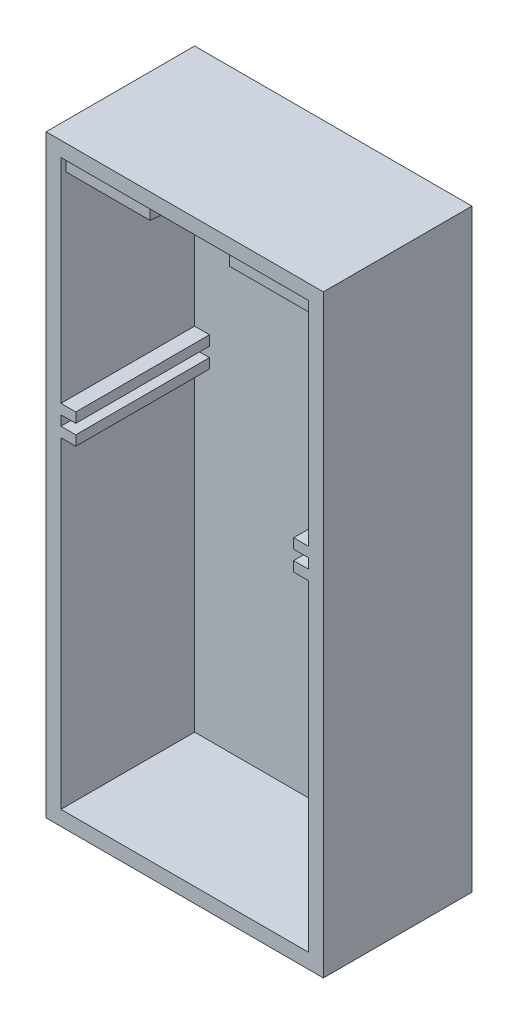
ISO-10303-21;
HEADER;
FILE_DESCRIPTION(('STEP AP214'),'2;1');
FILE_NAME('part.step','',(''),(''),'','','');
FILE_SCHEMA(('AUTOMOTIVE_DESIGN { 1 0 10303 214 1 1 1 1 }'));
ENDSEC;
DATA;
#1=APPLICATION_CONTEXT('core data for automotive mechanical design processes');
#2=APPLICATION_PROTOCOL_DEFINITION('international standard','automotive_design',2000,#1);
#3=PRODUCT_CONTEXT('',#1,'mechanical');
#4=PRODUCT('Part','Part','',(#3));
#5=PRODUCT_RELATED_PRODUCT_CATEGORY('part','',(#4));
#6=PRODUCT_DEFINITION_FORMATION('','',#4);
#7=PRODUCT_DEFINITION_CONTEXT('part definition',#1,'design');
#8=PRODUCT_DEFINITION('design','',#6,#7);
#9=PRODUCT_DEFINITION_SHAPE('','',#8);
#10=(LENGTH_UNIT() NAMED_UNIT(*) SI_UNIT(.MILLI.,.METRE.));
#11=(NAMED_UNIT(*) PLANE_ANGLE_UNIT() SI_UNIT($,.RADIAN.));
#12=(NAMED_UNIT(*) SI_UNIT($,.STERADIAN.) SOLID_ANGLE_UNIT());
#13=UNCERTAINTY_MEASURE_WITH_UNIT(LENGTH_MEASURE(1.E-05),#10,'distance_accuracy_value','');
#14=(GEOMETRIC_REPRESENTATION_CONTEXT(3) GLOBAL_UNCERTAINTY_ASSIGNED_CONTEXT((#13)) GLOBAL_UNIT_ASSIGNED_CONTEXT((#10,
#11,#12)) REPRESENTATION_CONTEXT('',''));
#15=CARTESIAN_POINT('',(0.,0.,0.));
#16=DIRECTION('',(0.,0.,1.));
#17=DIRECTION('',(1.,0.,0.));
#18=AXIS2_PLACEMENT_3D('',#15,#16,#17);
#19=CARTESIAN_POINT('',(-3.,0.,30.));
#20=DIRECTION('',(-1.,0.,0.));
#21=DIRECTION('',(0.,0.,1.));
#22=AXIS2_PLACEMENT_3D('',#19,#20,#21);
#23=PLANE('',#22);
#24=DIRECTION('',(0.,0.,1.));
#25=VECTOR('',#24,1.);
#26=CARTESIAN_POINT('',(-3.,70.,30.));
#27=LINE('',#26,#25);
#28=CARTESIAN_POINT('',(-3.,70.,3.));
#29=VERTEX_POINT('',#28);
#30=CARTESIAN_POINT('',(-3.,70.,30.));
#31=VERTEX_POINT('',#30);
#32=EDGE_CURVE('E244',#29,#31,#27,.T.);
#33=ORIENTED_EDGE('',*,*,#32,.T.);
#34=DIRECTION('',(0.,1.,0.));
#35=VECTOR('',#34,1.);
#36=CARTESIAN_POINT('',(-3.,0.,30.));
#37=LINE('',#36,#35);
#38=CARTESIAN_POINT('',(-3.,72.,30.));
#39=VERTEX_POINT('',#38);
#40=EDGE_CURVE('E236',#31,#39,#37,.T.);
#41=ORIENTED_EDGE('',*,*,#40,.T.);
#42=DIRECTION('',(0.,0.,-1.));
#43=VECTOR('',#42,1.);
#44=CARTESIAN_POINT('',(-3.,72.,30.));
#45=LINE('',#44,#43);
#46=CARTESIAN_POINT('',(-3.,72.,3.));
#47=VERTEX_POINT('',#46);
#48=EDGE_CURVE('E258',#39,#47,#45,.T.);
#49=ORIENTED_EDGE('',*,*,#48,.T.);
#50=DIRECTION('',(0.,1.,0.));
#51=VECTOR('',#50,1.);
#52=CARTESIAN_POINT('',(-3.,0.,3.));
#53=LINE('',#52,#51);
#54=EDGE_CURVE('E369',#29,#47,#53,.T.);
#55=ORIENTED_EDGE('',*,*,#54,.F.);
#56=EDGE_LOOP('',(#33,#41,#49,#55));
#57=FACE_BOUND('',#56,.T.);
#58=ADVANCED_FACE('F33',(#57),#23,.T.);
#59=DIRECTION('',(0.,0.,1.));
#60=VECTOR('',#59,1.);
#61=CARTESIAN_POINT('',(-3.,74.,30.));
#62=LINE('',#61,#60);
#63=CARTESIAN_POINT('',(-3.,74.,3.));
#64=VERTEX_POINT('',#63);
#65=CARTESIAN_POINT('',(-3.,74.,30.));
#66=VERTEX_POINT('',#65);
#67=EDGE_CURVE('E253',#64,#66,#62,.T.);
#68=ORIENTED_EDGE('',*,*,#67,.T.);
#69=CARTESIAN_POINT('',(-3.,117.,30.));
#70=VERTEX_POINT('',#69);
#71=EDGE_CURVE('E390',#66,#70,#37,.T.);
#72=ORIENTED_EDGE('',*,*,#71,.T.);
#73=DIRECTION('',(0.,0.,-1.));
#74=VECTOR('',#73,1.);
#75=CARTESIAN_POINT('',(-3.,117.,30.));
#76=LINE('',#75,#74);
#77=CARTESIAN_POINT('',(-3.,117.,29.));
#78=VERTEX_POINT('',#77);
#79=EDGE_CURVE('E370',#70,#78,#76,.T.);
#80=ORIENTED_EDGE('',*,*,#79,.T.);
#81=DIRECTION('',(0.,1.,0.));
#82=VECTOR('',#81,1.);
#83=CARTESIAN_POINT('',(-3.,117.,29.));
#84=LINE('',#83,#82);
#85=CARTESIAN_POINT('',(-3.,114.,29.));
#86=VERTEX_POINT('',#85);
#87=EDGE_CURVE('E352',#86,#78,#84,.T.);
#88=ORIENTED_EDGE('',*,*,#87,.F.);
#89=DIRECTION('',(0.,0.,-1.));
#90=VECTOR('',#89,1.);
#91=CARTESIAN_POINT('',(-3.,114.,29.));
#92=LINE('',#91,#90);
#93=CARTESIAN_POINT('',(-3.,114.,3.));
#94=VERTEX_POINT('',#93);
#95=EDGE_CURVE('E358',#86,#94,#92,.T.);
#96=ORIENTED_EDGE('',*,*,#95,.T.);
#97=EDGE_CURVE('E365',#64,#94,#53,.T.);
#98=ORIENTED_EDGE('',*,*,#97,.F.);
#99=EDGE_LOOP('',(#68,#72,#80,#88,#96,#98));
#100=FACE_BOUND('',#99,.T.);
#101=ADVANCED_FACE('F450',(#100),#23,.T.);
#102=CARTESIAN_POINT('',(-53.,0.,30.));
#103=DIRECTION('',(1.,0.,0.));
#104=DIRECTION('',(0.,0.,-1.));
#105=AXIS2_PLACEMENT_3D('',#102,#103,#104);
#106=PLANE('',#105);
#107=DIRECTION('',(0.,-1.,0.));
#108=VECTOR('',#107,1.);
#109=CARTESIAN_POINT('',(-53.,0.,3.));
#110=LINE('',#109,#108);
#111=CARTESIAN_POINT('',(-53.,68.,3.));
#112=VERTEX_POINT('',#111);
#113=CARTESIAN_POINT('',(-53.,2.99999999999999,3.));
#114=VERTEX_POINT('',#113);
#115=EDGE_CURVE('E368',#112,#114,#110,.T.);
#116=ORIENTED_EDGE('',*,*,#115,.F.);
#117=DIRECTION('',(0.,0.,-1.));
#118=VECTOR('',#117,1.);
#119=CARTESIAN_POINT('',(-53.,68.,30.));
#120=LINE('',#119,#118);
#121=CARTESIAN_POINT('',(-53.,68.,30.));
#122=VERTEX_POINT('',#121);
#123=EDGE_CURVE('E281',#122,#112,#120,.T.);
#124=ORIENTED_EDGE('',*,*,#123,.F.);
#125=DIRECTION('',(0.,-1.,0.));
#126=VECTOR('',#125,1.);
#127=CARTESIAN_POINT('',(-53.,0.,30.));
#128=LINE('',#127,#126);
#129=CARTESIAN_POINT('',(-53.,2.99999999999999,30.));
#130=VERTEX_POINT('',#129);
#131=EDGE_CURVE('E395',#122,#130,#128,.T.);
#132=ORIENTED_EDGE('',*,*,#131,.T.);
#133=DIRECTION('',(0.,0.,-1.));
#134=VECTOR('',#133,1.);
#135=CARTESIAN_POINT('',(-53.,2.99999999999999,30.));
#136=LINE('',#135,#134);
#137=EDGE_CURVE('E378',#130,#114,#136,.T.);
#138=ORIENTED_EDGE('',*,*,#137,.T.);
#139=EDGE_LOOP('',(#116,#124,#132,#138));
#140=FACE_BOUND('',#139,.T.);
#141=ADVANCED_FACE('F456',(#140),#106,.T.);
#142=CARTESIAN_POINT('',(-53.,72.,30.));
#143=VERTEX_POINT('',#142);
#144=CARTESIAN_POINT('',(-53.,70.,30.));
#145=VERTEX_POINT('',#144);
#146=EDGE_CURVE('E398',#143,#145,#128,.T.);
#147=ORIENTED_EDGE('',*,*,#146,.T.);
#148=DIRECTION('',(0.,0.,1.));
#149=VECTOR('',#148,1.);
#150=CARTESIAN_POINT('',(-53.,70.,30.));
#151=LINE('',#150,#149);
#152=CARTESIAN_POINT('',(-53.,70.,3.));
#153=VERTEX_POINT('',#152);
#154=EDGE_CURVE('E286',#153,#145,#151,.T.);
#155=ORIENTED_EDGE('',*,*,#154,.F.);
#156=CARTESIAN_POINT('',(-53.,72.,3.));
#157=VERTEX_POINT('',#156);
#158=EDGE_CURVE('E386',#157,#153,#110,.T.);
#159=ORIENTED_EDGE('',*,*,#158,.F.);
#160=DIRECTION('',(0.,0.,-1.));
#161=VECTOR('',#160,1.);
#162=CARTESIAN_POINT('',(-53.,72.,30.));
#163=LINE('',#162,#161);
#164=EDGE_CURVE('E308',#143,#157,#163,.T.);
#165=ORIENTED_EDGE('',*,*,#164,.F.);
#166=EDGE_LOOP('',(#147,#155,#159,#165));
#167=FACE_BOUND('',#166,.T.);
#168=ADVANCED_FACE('F487',(#167),#106,.T.);
#169=CARTESIAN_POINT('',(0.,0.,3.));
#170=DIRECTION('',(0.,0.,1.));
#171=DIRECTION('',(1.,0.,0.));
#172=AXIS2_PLACEMENT_3D('',#169,#170,#171);
#173=PLANE('',#172);
#174=DIRECTION('',(-1.,0.,0.));
#175=VECTOR('',#174,1.);
#176=CARTESIAN_POINT('',(0.,70.,3.));
#177=LINE('',#176,#175);
#178=CARTESIAN_POINT('',(-6.,70.,3.));
#179=VERTEX_POINT('',#178);
#180=EDGE_CURVE('E222',#29,#179,#177,.T.);
#181=ORIENTED_EDGE('',*,*,#180,.F.);
#182=ORIENTED_EDGE('',*,*,#54,.T.);
#183=DIRECTION('',(1.,0.,0.));
#184=VECTOR('',#183,1.);
#185=CARTESIAN_POINT('',(0.,72.,3.));
#186=LINE('',#185,#184);
#187=CARTESIAN_POINT('',(-6.,72.,3.));
#188=VERTEX_POINT('',#187);
#189=EDGE_CURVE('E275',#188,#47,#186,.T.);
#190=ORIENTED_EDGE('',*,*,#189,.F.);
#191=DIRECTION('',(0.,-1.,0.));
#192=VECTOR('',#191,1.);
#193=CARTESIAN_POINT('',(-6.,0.,3.));
#194=LINE('',#193,#192);
#195=CARTESIAN_POINT('',(-6.,74.,3.));
#196=VERTEX_POINT('',#195);
#197=EDGE_CURVE('E272',#196,#188,#194,.T.);
#198=ORIENTED_EDGE('',*,*,#197,.F.);
#199=DIRECTION('',(-1.,0.,0.));
#200=VECTOR('',#199,1.);
#201=CARTESIAN_POINT('',(0.,74.,3.));
#202=LINE('',#201,#200);
#203=EDGE_CURVE('E278',#64,#196,#202,.T.);
#204=ORIENTED_EDGE('',*,*,#203,.F.);
#205=ORIENTED_EDGE('',*,*,#97,.T.);
#206=DIRECTION('',(1.,0.,0.));
#207=VECTOR('',#206,1.);
#208=CARTESIAN_POINT('',(-53.,114.,3.));
#209=LINE('',#208,#207);
#210=CARTESIAN_POINT('',(-53.,114.,3.));
#211=VERTEX_POINT('',#210);
#212=EDGE_CURVE('E342',#211,#94,#209,.T.);
#213=ORIENTED_EDGE('',*,*,#212,.F.);
#214=CARTESIAN_POINT('',(-53.,74.,3.));
#215=VERTEX_POINT('',#214);
#216=EDGE_CURVE('E382',#211,#215,#110,.T.);
#217=ORIENTED_EDGE('',*,*,#216,.T.);
#218=DIRECTION('',(1.,0.,0.));
#219=VECTOR('',#218,1.);
#220=CARTESIAN_POINT('',(0.,74.,3.));
#221=LINE('',#220,#219);
#222=CARTESIAN_POINT('',(-50.,74.,3.));
#223=VERTEX_POINT('',#222);
#224=EDGE_CURVE('E331',#215,#223,#221,.T.);
#225=ORIENTED_EDGE('',*,*,#224,.T.);
#226=DIRECTION('',(0.,1.,0.));
#227=VECTOR('',#226,1.);
#228=CARTESIAN_POINT('',(-50.,0.,3.));
#229=LINE('',#228,#227);
#230=CARTESIAN_POINT('',(-50.,72.,3.));
#231=VERTEX_POINT('',#230);
#232=EDGE_CURVE('E328',#231,#223,#229,.T.);
#233=ORIENTED_EDGE('',*,*,#232,.F.);
#234=DIRECTION('',(-1.,0.,0.));
#235=VECTOR('',#234,1.);
#236=CARTESIAN_POINT('',(0.,72.,3.));
#237=LINE('',#236,#235);
#238=EDGE_CURVE('E333',#231,#157,#237,.T.);
#239=ORIENTED_EDGE('',*,*,#238,.T.);
#240=ORIENTED_EDGE('',*,*,#158,.T.);
#241=DIRECTION('',(1.,0.,0.));
#242=VECTOR('',#241,1.);
#243=CARTESIAN_POINT('',(0.,70.,3.));
#244=LINE('',#243,#242);
#245=CARTESIAN_POINT('',(-50.,70.,3.));
#246=VERTEX_POINT('',#245);
#247=EDGE_CURVE('E304',#153,#246,#244,.T.);
#248=ORIENTED_EDGE('',*,*,#247,.T.);
#249=DIRECTION('',(0.,1.,0.));
#250=VECTOR('',#249,1.);
#251=CARTESIAN_POINT('',(-50.,0.,3.));
#252=LINE('',#251,#250);
#253=CARTESIAN_POINT('',(-50.,68.,3.));
#254=VERTEX_POINT('',#253);
#255=EDGE_CURVE('E301',#254,#246,#252,.T.);
#256=ORIENTED_EDGE('',*,*,#255,.F.);
#257=DIRECTION('',(-1.,0.,0.));
#258=VECTOR('',#257,1.);
#259=CARTESIAN_POINT('',(0.,68.,3.));
#260=LINE('',#259,#258);
#261=EDGE_CURVE('E306',#254,#112,#260,.T.);
#262=ORIENTED_EDGE('',*,*,#261,.T.);
#263=ORIENTED_EDGE('',*,*,#115,.T.);
#264=DIRECTION('',(1.,0.,0.));
#265=VECTOR('',#264,1.);
#266=CARTESIAN_POINT('',(0.,3.,3.));
#267=LINE('',#266,#265);
#268=CARTESIAN_POINT('',(-3.,3.,3.));
#269=VERTEX_POINT('',#268);
#270=EDGE_CURVE('E385',#114,#269,#267,.T.);
#271=ORIENTED_EDGE('',*,*,#270,.T.);
#272=CARTESIAN_POINT('',(-3.,68.,3.));
#273=VERTEX_POINT('',#272);
#274=EDGE_CURVE('E366',#269,#273,#53,.T.);
#275=ORIENTED_EDGE('',*,*,#274,.T.);
#276=DIRECTION('',(1.,0.,0.));
#277=VECTOR('',#276,1.);
#278=CARTESIAN_POINT('',(0.,68.,3.));
#279=LINE('',#278,#277);
#280=CARTESIAN_POINT('',(-6.,68.,3.));
#281=VERTEX_POINT('',#280);
#282=EDGE_CURVE('E48',#281,#273,#279,.T.);
#283=ORIENTED_EDGE('',*,*,#282,.F.);
#284=DIRECTION('',(0.,-1.,0.));
#285=VECTOR('',#284,1.);
#286=CARTESIAN_POINT('',(-6.,0.,3.));
#287=LINE('',#286,#285);
#288=EDGE_CURVE('E52',#179,#281,#287,.T.);
#289=ORIENTED_EDGE('',*,*,#288,.F.);
#290=EDGE_LOOP('',(#181,#182,#190,#198,#204,#205,#213,#217,#225,#233,#239,#240,#248,#256,#262,
#263,#271,#275,#283,#289));
#291=FACE_BOUND('',#290,.T.);
#292=ADVANCED_FACE('F474',(#291),#173,.T.);
#293=CARTESIAN_POINT('',(-53.,117.,30.));
#294=VERTEX_POINT('',#293);
#295=CARTESIAN_POINT('',(-53.,74.,30.));
#296=VERTEX_POINT('',#295);
#297=EDGE_CURVE('E396',#294,#296,#128,.T.);
#298=ORIENTED_EDGE('',*,*,#297,.T.);
#299=DIRECTION('',(0.,0.,1.));
#300=VECTOR('',#299,1.);
#301=CARTESIAN_POINT('',(-53.,74.,30.));
#302=LINE('',#301,#300);
#303=EDGE_CURVE('E313',#215,#296,#302,.T.);
#304=ORIENTED_EDGE('',*,*,#303,.F.);
#305=ORIENTED_EDGE('',*,*,#216,.F.);
#306=DIRECTION('',(0.,0.,-1.));
#307=VECTOR('',#306,1.);
#308=CARTESIAN_POINT('',(-53.,114.,29.));
#309=LINE('',#308,#307);
#310=CARTESIAN_POINT('',(-53.,114.,29.));
#311=VERTEX_POINT('',#310);
#312=EDGE_CURVE('E363',#311,#211,#309,.T.);
#313=ORIENTED_EDGE('',*,*,#312,.F.);
#314=DIRECTION('',(0.,-1.,0.));
#315=VECTOR('',#314,1.);
#316=CARTESIAN_POINT('',(-53.,117.,29.));
#317=LINE('',#316,#315);
#318=CARTESIAN_POINT('',(-53.,117.,29.));
#319=VERTEX_POINT('',#318);
#320=EDGE_CURVE('E345',#319,#311,#317,.T.);
#321=ORIENTED_EDGE('',*,*,#320,.F.);
#322=DIRECTION('',(0.,0.,-1.));
#323=VECTOR('',#322,1.);
#324=CARTESIAN_POINT('',(-53.,117.,30.));
#325=LINE('',#324,#323);
#326=EDGE_CURVE('E374',#294,#319,#325,.T.);
#327=ORIENTED_EDGE('',*,*,#326,.F.);
#328=EDGE_LOOP('',(#298,#304,#305,#313,#321,#327));
#329=FACE_BOUND('',#328,.T.);
#330=ADVANCED_FACE('F466',(#329),#106,.T.);
#331=CARTESIAN_POINT('',(0.,0.,29.));
#332=DIRECTION('',(0.,0.,1.));
#333=DIRECTION('',(1.,0.,0.));
#334=AXIS2_PLACEMENT_3D('',#331,#332,#333);
#335=PLANE('',#334);
#336=DIRECTION('',(0.,-1.,0.));
#337=VECTOR('',#336,1.);
#338=CARTESIAN_POINT('',(-36.,117.,29.));
#339=LINE('',#338,#337);
#340=CARTESIAN_POINT('',(-36.,117.,29.));
#341=VERTEX_POINT('',#340);
#342=CARTESIAN_POINT('',(-36.,114.,29.));
#343=VERTEX_POINT('',#342);
#344=EDGE_CURVE('E340',#341,#343,#339,.T.);
#345=ORIENTED_EDGE('',*,*,#344,.F.);
#346=DIRECTION('',(-1.,0.,0.));
#347=VECTOR('',#346,1.);
#348=CARTESIAN_POINT('',(-53.,117.,29.));
#349=LINE('',#348,#347);
#350=EDGE_CURVE('E354',#341,#319,#349,.T.);
#351=ORIENTED_EDGE('',*,*,#350,.T.);
#352=ORIENTED_EDGE('',*,*,#320,.T.);
#353=DIRECTION('',(1.,0.,0.));
#354=VECTOR('',#353,1.);
#355=CARTESIAN_POINT('',(-53.,114.,29.));
#356=LINE('',#355,#354);
#357=EDGE_CURVE('E349',#311,#343,#356,.T.);
#358=ORIENTED_EDGE('',*,*,#357,.T.);
#359=EDGE_LOOP('',(#345,#351,#352,#358));
#360=FACE_BOUND('',#359,.T.);
#361=ADVANCED_FACE('F461',(#360),#335,.T.);
#362=DIRECTION('',(0.,0.,-1.));
#363=VECTOR('',#362,1.);
#364=CARTESIAN_POINT('',(-3.,68.,30.));
#365=LINE('',#364,#363);
#366=CARTESIAN_POINT('',(-3.,68.,30.));
#367=VERTEX_POINT('',#366);
#368=EDGE_CURVE('E242',#367,#273,#365,.T.);
#369=ORIENTED_EDGE('',*,*,#368,.T.);
#370=ORIENTED_EDGE('',*,*,#274,.F.);
#371=DIRECTION('',(0.,0.,-1.));
#372=VECTOR('',#371,1.);
#373=CARTESIAN_POINT('',(-3.,3.,30.));
#374=LINE('',#373,#372);
#375=CARTESIAN_POINT('',(-3.,3.,30.));
#376=VERTEX_POINT('',#375);
#377=EDGE_CURVE('E375',#376,#269,#374,.T.);
#378=ORIENTED_EDGE('',*,*,#377,.F.);
#379=EDGE_CURVE('E391',#376,#367,#37,.T.);
#380=ORIENTED_EDGE('',*,*,#379,.T.);
#381=EDGE_LOOP('',(#369,#370,#378,#380));
#382=FACE_BOUND('',#381,.T.);
#383=ADVANCED_FACE('F448',(#382),#23,.T.);
#384=CARTESIAN_POINT('',(0.,0.,30.));
#385=DIRECTION('',(-1.,0.,0.));
#386=DIRECTION('',(0.,0.,1.));
#387=AXIS2_PLACEMENT_3D('',#384,#385,#386);
#388=PLANE('',#387);
#389=DIRECTION('',(0.,1.,0.));
#390=VECTOR('',#389,1.);
#391=CARTESIAN_POINT('',(0.,0.,0.));
#392=LINE('',#391,#390);
#393=CARTESIAN_POINT('',(0.,0.,0.));
#394=VERTEX_POINT('',#393);
#395=CARTESIAN_POINT('',(0.,120.,0.));
#396=VERTEX_POINT('',#395);
#397=EDGE_CURVE('E373',#394,#396,#392,.T.);
#398=ORIENTED_EDGE('',*,*,#397,.T.);
#399=DIRECTION('',(0.,0.,-1.));
#400=VECTOR('',#399,1.);
#401=CARTESIAN_POINT('',(0.,120.,30.));
#402=LINE('',#401,#400);
#403=CARTESIAN_POINT('',(0.,120.,30.));
#404=VERTEX_POINT('',#403);
#405=EDGE_CURVE('E11',#404,#396,#402,.T.);
#406=ORIENTED_EDGE('',*,*,#405,.F.);
#407=DIRECTION('',(0.,1.,0.));
#408=VECTOR('',#407,1.);
#409=CARTESIAN_POINT('',(0.,0.,30.));
#410=LINE('',#409,#408);
#411=CARTESIAN_POINT('',(0.,0.,30.));
#412=VERTEX_POINT('',#411);
#413=EDGE_CURVE('E400',#412,#404,#410,.T.);
#414=ORIENTED_EDGE('',*,*,#413,.F.);
#415=DIRECTION('',(0.,0.,-1.));
#416=VECTOR('',#415,1.);
#417=CARTESIAN_POINT('',(0.,0.,30.));
#418=LINE('',#417,#416);
#419=EDGE_CURVE('E410',#412,#394,#418,.T.);
#420=ORIENTED_EDGE('',*,*,#419,.T.);
#421=EDGE_LOOP('',(#398,#406,#414,#420));
#422=FACE_BOUND('',#421,.T.);
#423=ADVANCED_FACE('F35',(#422),#388,.F.);
#424=CARTESIAN_POINT('',(0.,120.,30.));
#425=DIRECTION('',(0.,-1.,0.));
#426=DIRECTION('',(0.,0.,-1.));
#427=AXIS2_PLACEMENT_3D('',#424,#425,#426);
#428=PLANE('',#427);
#429=DIRECTION('',(-1.,0.,0.));
#430=VECTOR('',#429,1.);
#431=CARTESIAN_POINT('',(0.,120.,0.));
#432=LINE('',#431,#430);
#433=CARTESIAN_POINT('',(-56.,120.,0.));
#434=VERTEX_POINT('',#433);
#435=EDGE_CURVE('E413',#396,#434,#432,.T.);
#436=ORIENTED_EDGE('',*,*,#435,.T.);
#437=DIRECTION('',(0.,0.,-1.));
#438=VECTOR('',#437,1.);
#439=CARTESIAN_POINT('',(-56.,120.,30.));
#440=LINE('',#439,#438);
#441=CARTESIAN_POINT('',(-56.,120.,30.));
#442=VERTEX_POINT('',#441);
#443=EDGE_CURVE('E41',#442,#434,#440,.T.);
#444=ORIENTED_EDGE('',*,*,#443,.F.);
#445=DIRECTION('',(-1.,0.,0.));
#446=VECTOR('',#445,1.);
#447=CARTESIAN_POINT('',(0.,120.,30.));
#448=LINE('',#447,#446);
#449=EDGE_CURVE('E403',#404,#442,#448,.T.);
#450=ORIENTED_EDGE('',*,*,#449,.F.);
#451=ORIENTED_EDGE('',*,*,#405,.T.);
#452=EDGE_LOOP('',(#436,#444,#450,#451));
#453=FACE_BOUND('',#452,.T.);
#454=ADVANCED_FACE('F441',(#453),#428,.F.);
#455=CARTESIAN_POINT('',(-56.,0.,30.));
#456=DIRECTION('',(1.,0.,0.));
#457=DIRECTION('',(0.,0.,-1.));
#458=AXIS2_PLACEMENT_3D('',#455,#456,#457);
#459=PLANE('',#458);
#460=DIRECTION('',(0.,-1.,0.));
#461=VECTOR('',#460,1.);
#462=CARTESIAN_POINT('',(-56.,0.,0.));
#463=LINE('',#462,#461);
#464=CARTESIAN_POINT('',(-56.,0.,0.));
#465=VERTEX_POINT('',#464);
#466=EDGE_CURVE('E415',#434,#465,#463,.T.);
#467=ORIENTED_EDGE('',*,*,#466,.T.);
#468=DIRECTION('',(0.,0.,-1.));
#469=VECTOR('',#468,1.);
#470=CARTESIAN_POINT('',(-56.,0.,30.));
#471=LINE('',#470,#469);
#472=CARTESIAN_POINT('',(-56.,0.,30.));
#473=VERTEX_POINT('',#472);
#474=EDGE_CURVE('E420',#473,#465,#471,.T.);
#475=ORIENTED_EDGE('',*,*,#474,.F.);
#476=DIRECTION('',(0.,-1.,0.));
#477=VECTOR('',#476,1.);
#478=CARTESIAN_POINT('',(-56.,0.,30.));
#479=LINE('',#478,#477);
#480=EDGE_CURVE('E406',#442,#473,#479,.T.);
#481=ORIENTED_EDGE('',*,*,#480,.F.);
#482=ORIENTED_EDGE('',*,*,#443,.T.);
#483=EDGE_LOOP('',(#467,#475,#481,#482));
#484=FACE_BOUND('',#483,.T.);
#485=ADVANCED_FACE('F427',(#484),#459,.F.);
#486=CARTESIAN_POINT('',(0.,0.,30.));
#487=DIRECTION('',(0.,1.,0.));
#488=DIRECTION('',(-1.,0.,0.));
#489=AXIS2_PLACEMENT_3D('',#486,#487,#488);
#490=PLANE('',#489);
#491=DIRECTION('',(1.,0.,0.));
#492=VECTOR('',#491,1.);
#493=CARTESIAN_POINT('',(0.,0.,0.));
#494=LINE('',#493,#492);
#495=EDGE_CURVE('E404',#465,#394,#494,.T.);
#496=ORIENTED_EDGE('',*,*,#495,.T.);
#497=ORIENTED_EDGE('',*,*,#419,.F.);
#498=DIRECTION('',(1.,0.,0.));
#499=VECTOR('',#498,1.);
#500=CARTESIAN_POINT('',(0.,0.,30.));
#501=LINE('',#500,#499);
#502=EDGE_CURVE('E408',#473,#412,#501,.T.);
#503=ORIENTED_EDGE('',*,*,#502,.F.);
#504=ORIENTED_EDGE('',*,*,#474,.T.);
#505=EDGE_LOOP('',(#496,#497,#503,#504));
#506=FACE_BOUND('',#505,.T.);
#507=ADVANCED_FACE('F436',(#506),#490,.F.);
#508=CARTESIAN_POINT('',(0.,0.,30.));
#509=DIRECTION('',(0.,0.,1.));
#510=DIRECTION('',(1.,0.,0.));
#511=AXIS2_PLACEMENT_3D('',#508,#509,#510);
#512=PLANE('',#511);
#513=ORIENTED_EDGE('',*,*,#379,.F.);
#514=DIRECTION('',(1.,0.,0.));
#515=VECTOR('',#514,1.);
#516=CARTESIAN_POINT('',(0.,3.,30.));
#517=LINE('',#516,#515);
#518=EDGE_CURVE('E379',#130,#376,#517,.T.);
#519=ORIENTED_EDGE('',*,*,#518,.F.);
#520=ORIENTED_EDGE('',*,*,#131,.F.);
#521=DIRECTION('',(-1.,0.,0.));
#522=VECTOR('',#521,1.);
#523=CARTESIAN_POINT('',(-50.,68.,30.));
#524=LINE('',#523,#522);
#525=CARTESIAN_POINT('',(-50.,68.,30.));
#526=VERTEX_POINT('',#525);
#527=EDGE_CURVE('E298',#526,#122,#524,.T.);
#528=ORIENTED_EDGE('',*,*,#527,.F.);
#529=DIRECTION('',(0.,-1.,0.));
#530=VECTOR('',#529,1.);
#531=CARTESIAN_POINT('',(-50.,70.,30.));
#532=LINE('',#531,#530);
#533=CARTESIAN_POINT('',(-50.,70.,30.));
#534=VERTEX_POINT('',#533);
#535=EDGE_CURVE('E282',#534,#526,#532,.T.);
#536=ORIENTED_EDGE('',*,*,#535,.F.);
#537=DIRECTION('',(-1.,0.,0.));
#538=VECTOR('',#537,1.);
#539=CARTESIAN_POINT('',(-50.,70.,30.));
#540=LINE('',#539,#538);
#541=EDGE_CURVE('E291',#534,#145,#540,.T.);
#542=ORIENTED_EDGE('',*,*,#541,.T.);
#543=ORIENTED_EDGE('',*,*,#146,.F.);
#544=DIRECTION('',(-1.,0.,0.));
#545=VECTOR('',#544,1.);
#546=CARTESIAN_POINT('',(-50.,72.,30.));
#547=LINE('',#546,#545);
#548=CARTESIAN_POINT('',(-50.,72.,30.));
#549=VERTEX_POINT('',#548);
#550=EDGE_CURVE('E325',#549,#143,#547,.T.);
#551=ORIENTED_EDGE('',*,*,#550,.F.);
#552=DIRECTION('',(0.,-1.,0.));
#553=VECTOR('',#552,1.);
#554=CARTESIAN_POINT('',(-50.,74.,30.));
#555=LINE('',#554,#553);
#556=CARTESIAN_POINT('',(-50.,74.,30.));
#557=VERTEX_POINT('',#556);
#558=EDGE_CURVE('E309',#557,#549,#555,.T.);
#559=ORIENTED_EDGE('',*,*,#558,.F.);
#560=DIRECTION('',(-1.,0.,0.));
#561=VECTOR('',#560,1.);
#562=CARTESIAN_POINT('',(-50.,74.,30.));
#563=LINE('',#562,#561);
#564=EDGE_CURVE('E318',#557,#296,#563,.T.);
#565=ORIENTED_EDGE('',*,*,#564,.T.);
#566=ORIENTED_EDGE('',*,*,#297,.F.);
#567=DIRECTION('',(-1.,0.,0.));
#568=VECTOR('',#567,1.);
#569=CARTESIAN_POINT('',(0.,117.,30.));
#570=LINE('',#569,#568);
#571=EDGE_CURVE('E393',#70,#294,#570,.T.);
#572=ORIENTED_EDGE('',*,*,#571,.F.);
#573=ORIENTED_EDGE('',*,*,#71,.F.);
#574=DIRECTION('',(1.,0.,0.));
#575=VECTOR('',#574,1.);
#576=CARTESIAN_POINT('',(-6.,74.,30.));
#577=LINE('',#576,#575);
#578=CARTESIAN_POINT('',(-6.,74.,30.));
#579=VERTEX_POINT('',#578);
#580=EDGE_CURVE('E269',#579,#66,#577,.T.);
#581=ORIENTED_EDGE('',*,*,#580,.F.);
#582=DIRECTION('',(0.,-1.,0.));
#583=VECTOR('',#582,1.);
#584=CARTESIAN_POINT('',(-6.,74.,30.));
#585=LINE('',#584,#583);
#586=CARTESIAN_POINT('',(-6.,72.,30.));
#587=VERTEX_POINT('',#586);
#588=EDGE_CURVE('E254',#579,#587,#585,.T.);
#589=ORIENTED_EDGE('',*,*,#588,.T.);
#590=DIRECTION('',(1.,0.,0.));
#591=VECTOR('',#590,1.);
#592=CARTESIAN_POINT('',(-6.,72.,30.));
#593=LINE('',#592,#591);
#594=EDGE_CURVE('E263',#587,#39,#593,.T.);
#595=ORIENTED_EDGE('',*,*,#594,.T.);
#596=ORIENTED_EDGE('',*,*,#40,.F.);
#597=DIRECTION('',(1.,0.,0.));
#598=VECTOR('',#597,1.);
#599=CARTESIAN_POINT('',(-6.,70.,30.));
#600=LINE('',#599,#598);
#601=CARTESIAN_POINT('',(-6.,70.,30.));
#602=VERTEX_POINT('',#601);
#603=EDGE_CURVE('E221',#602,#31,#600,.T.);
#604=ORIENTED_EDGE('',*,*,#603,.F.);
#605=DIRECTION('',(0.,-1.,0.));
#606=VECTOR('',#605,1.);
#607=CARTESIAN_POINT('',(-6.,70.,30.));
#608=LINE('',#607,#606);
#609=CARTESIAN_POINT('',(-6.,68.,30.));
#610=VERTEX_POINT('',#609);
#611=EDGE_CURVE('E226',#602,#610,#608,.T.);
#612=ORIENTED_EDGE('',*,*,#611,.T.);
#613=DIRECTION('',(1.,0.,0.));
#614=VECTOR('',#613,1.);
#615=CARTESIAN_POINT('',(-6.,68.,30.));
#616=LINE('',#615,#614);
#617=EDGE_CURVE('E238',#610,#367,#616,.T.);
#618=ORIENTED_EDGE('',*,*,#617,.T.);
#619=EDGE_LOOP('',(#513,#519,#520,#528,#536,#542,#543,#551,#559,#565,#566,#572,#573,#581,#589,
#595,#596,#604,#612,#618));
#620=FACE_BOUND('',#619,.T.);
#621=ORIENTED_EDGE('',*,*,#413,.T.);
#622=ORIENTED_EDGE('',*,*,#449,.T.);
#623=ORIENTED_EDGE('',*,*,#480,.T.);
#624=ORIENTED_EDGE('',*,*,#502,.T.);
#625=EDGE_LOOP('',(#621,#622,#623,#624));
#626=FACE_BOUND('',#625,.T.);
#627=ADVANCED_FACE('F231',(#620,#626),#512,.T.);
#628=CARTESIAN_POINT('',(0.,0.,0.));
#629=DIRECTION('',(0.,0.,1.));
#630=DIRECTION('',(1.,0.,0.));
#631=AXIS2_PLACEMENT_3D('',#628,#629,#630);
#632=PLANE('',#631);
#633=ORIENTED_EDGE('',*,*,#397,.F.);
#634=ORIENTED_EDGE('',*,*,#495,.F.);
#635=ORIENTED_EDGE('',*,*,#466,.F.);
#636=ORIENTED_EDGE('',*,*,#435,.F.);
#637=EDGE_LOOP('',(#633,#634,#635,#636));
#638=FACE_BOUND('',#637,.T.);
#639=ADVANCED_FACE('F433',(#638),#632,.F.);
#640=CARTESIAN_POINT('',(0.,117.,30.));
#641=DIRECTION('',(0.,-1.,0.));
#642=DIRECTION('',(0.,0.,-1.));
#643=AXIS2_PLACEMENT_3D('',#640,#641,#642);
#644=PLANE('',#643);
#645=CARTESIAN_POINT('',(-20.,117.,29.));
#646=VERTEX_POINT('',#645);
#647=EDGE_CURVE('E355',#78,#646,#349,.T.);
#648=ORIENTED_EDGE('',*,*,#647,.F.);
#649=ORIENTED_EDGE('',*,*,#79,.F.);
#650=ORIENTED_EDGE('',*,*,#571,.T.);
#651=ORIENTED_EDGE('',*,*,#326,.T.);
#652=ORIENTED_EDGE('',*,*,#350,.F.);
#653=CARTESIAN_POINT('',(-28.,117.,29.));
#654=DIRECTION('',(0.,-1.,0.));
#655=DIRECTION('',(0.,0.,1.));
#656=AXIS2_PLACEMENT_3D('',#653,#654,#655);
#657=CIRCLE('',#656,8.);
#658=EDGE_CURVE('E336',#341,#646,#657,.T.);
#659=ORIENTED_EDGE('',*,*,#658,.T.);
#660=EDGE_LOOP('',(#648,#649,#650,#651,#652,#659));
#661=FACE_BOUND('',#660,.T.);
#662=ADVANCED_FACE('F533',(#661),#644,.T.);
#663=CARTESIAN_POINT('',(0.,3.,30.));
#664=DIRECTION('',(0.,1.,0.));
#665=DIRECTION('',(-1.,0.,0.));
#666=AXIS2_PLACEMENT_3D('',#663,#664,#665);
#667=PLANE('',#666);
#668=ORIENTED_EDGE('',*,*,#270,.F.);
#669=ORIENTED_EDGE('',*,*,#137,.F.);
#670=ORIENTED_EDGE('',*,*,#518,.T.);
#671=ORIENTED_EDGE('',*,*,#377,.T.);
#672=EDGE_LOOP('',(#668,#669,#670,#671));
#673=FACE_BOUND('',#672,.T.);
#674=ADVANCED_FACE('F482',(#673),#667,.T.);
#675=CARTESIAN_POINT('',(-53.,114.,29.));
#676=DIRECTION('',(0.,1.,0.));
#677=DIRECTION('',(0.,0.,1.));
#678=AXIS2_PLACEMENT_3D('',#675,#676,#677);
#679=PLANE('',#678);
#680=CARTESIAN_POINT('',(-20.,114.,29.));
#681=VERTEX_POINT('',#680);
#682=EDGE_CURVE('E348',#681,#86,#356,.T.);
#683=ORIENTED_EDGE('',*,*,#682,.F.);
#684=CARTESIAN_POINT('',(-28.,114.,29.));
#685=DIRECTION('',(0.,-1.,0.));
#686=DIRECTION('',(0.,0.,1.));
#687=AXIS2_PLACEMENT_3D('',#684,#685,#686);
#688=CIRCLE('',#687,8.);
#689=EDGE_CURVE('E335',#343,#681,#688,.T.);
#690=ORIENTED_EDGE('',*,*,#689,.F.);
#691=ORIENTED_EDGE('',*,*,#357,.F.);
#692=ORIENTED_EDGE('',*,*,#312,.T.);
#693=ORIENTED_EDGE('',*,*,#212,.T.);
#694=ORIENTED_EDGE('',*,*,#95,.F.);
#695=EDGE_LOOP('',(#683,#690,#691,#692,#693,#694));
#696=FACE_BOUND('',#695,.T.);
#697=ADVANCED_FACE('F526',(#696),#679,.F.);
#698=DIRECTION('',(0.,-1.,0.));
#699=VECTOR('',#698,1.);
#700=CARTESIAN_POINT('',(-20.,117.,29.));
#701=LINE('',#700,#699);
#702=EDGE_CURVE('E338',#646,#681,#701,.T.);
#703=ORIENTED_EDGE('',*,*,#702,.T.);
#704=ORIENTED_EDGE('',*,*,#682,.T.);
#705=ORIENTED_EDGE('',*,*,#87,.T.);
#706=ORIENTED_EDGE('',*,*,#647,.T.);
#707=EDGE_LOOP('',(#703,#704,#705,#706));
#708=FACE_BOUND('',#707,.T.);
#709=ADVANCED_FACE('F469',(#708),#335,.T.);
#710=CARTESIAN_POINT('',(-28.,117.,29.));
#711=DIRECTION('',(0.,-1.,0.));
#712=DIRECTION('',(0.,0.,-1.));
#713=AXIS2_PLACEMENT_3D('',#710,#711,#712);
#714=CYLINDRICAL_SURFACE('',#713,8.);
#715=ORIENTED_EDGE('',*,*,#689,.T.);
#716=ORIENTED_EDGE('',*,*,#702,.F.);
#717=ORIENTED_EDGE('',*,*,#658,.F.);
#718=ORIENTED_EDGE('',*,*,#344,.T.);
#719=EDGE_LOOP('',(#715,#716,#717,#718));
#720=FACE_BOUND('',#719,.T.);
#721=ADVANCED_FACE('F521',(#720),#714,.F.);
#722=CARTESIAN_POINT('',(-50.,72.,30.));
#723=DIRECTION('',(0.,1.,0.));
#724=DIRECTION('',(-1.,0.,0.));
#725=AXIS2_PLACEMENT_3D('',#722,#723,#724);
#726=PLANE('',#725);
#727=ORIENTED_EDGE('',*,*,#238,.F.);
#728=DIRECTION('',(0.,0.,-1.));
#729=VECTOR('',#728,1.);
#730=CARTESIAN_POINT('',(-50.,72.,30.));
#731=LINE('',#730,#729);
#732=EDGE_CURVE('E312',#549,#231,#731,.T.);
#733=ORIENTED_EDGE('',*,*,#732,.F.);
#734=ORIENTED_EDGE('',*,*,#550,.T.);
#735=ORIENTED_EDGE('',*,*,#164,.T.);
#736=EDGE_LOOP('',(#727,#733,#734,#735));
#737=FACE_BOUND('',#736,.T.);
#738=ADVANCED_FACE('F517',(#737),#726,.F.);
#739=CARTESIAN_POINT('',(-50.,74.,30.));
#740=DIRECTION('',(0.,-1.,0.));
#741=DIRECTION('',(1.,0.,0.));
#742=AXIS2_PLACEMENT_3D('',#739,#740,#741);
#743=PLANE('',#742);
#744=ORIENTED_EDGE('',*,*,#224,.F.);
#745=ORIENTED_EDGE('',*,*,#303,.T.);
#746=ORIENTED_EDGE('',*,*,#564,.F.);
#747=DIRECTION('',(0.,0.,1.));
#748=VECTOR('',#747,1.);
#749=CARTESIAN_POINT('',(-50.,74.,30.));
#750=LINE('',#749,#748);
#751=EDGE_CURVE('E316',#223,#557,#750,.T.);
#752=ORIENTED_EDGE('',*,*,#751,.F.);
#753=EDGE_LOOP('',(#744,#745,#746,#752));
#754=FACE_BOUND('',#753,.T.);
#755=ADVANCED_FACE('F510',(#754),#743,.F.);
#756=CARTESIAN_POINT('',(-50.,0.,0.));
#757=DIRECTION('',(1.,0.,0.));
#758=DIRECTION('',(0.,0.,-1.));
#759=AXIS2_PLACEMENT_3D('',#756,#757,#758);
#760=PLANE('',#759);
#761=ORIENTED_EDGE('',*,*,#732,.T.);
#762=ORIENTED_EDGE('',*,*,#232,.T.);
#763=ORIENTED_EDGE('',*,*,#751,.T.);
#764=ORIENTED_EDGE('',*,*,#558,.T.);
#765=EDGE_LOOP('',(#761,#762,#763,#764));
#766=FACE_BOUND('',#765,.T.);
#767=ADVANCED_FACE('F503',(#766),#760,.T.);
#768=CARTESIAN_POINT('',(-50.,68.,30.));
#769=DIRECTION('',(0.,1.,0.));
#770=DIRECTION('',(-1.,0.,0.));
#771=AXIS2_PLACEMENT_3D('',#768,#769,#770);
#772=PLANE('',#771);
#773=ORIENTED_EDGE('',*,*,#261,.F.);
#774=DIRECTION('',(0.,0.,-1.));
#775=VECTOR('',#774,1.);
#776=CARTESIAN_POINT('',(-50.,68.,30.));
#777=LINE('',#776,#775);
#778=EDGE_CURVE('E285',#526,#254,#777,.T.);
#779=ORIENTED_EDGE('',*,*,#778,.F.);
#780=ORIENTED_EDGE('',*,*,#527,.T.);
#781=ORIENTED_EDGE('',*,*,#123,.T.);
#782=EDGE_LOOP('',(#773,#779,#780,#781));
#783=FACE_BOUND('',#782,.T.);
#784=ADVANCED_FACE('F501',(#783),#772,.F.);
#785=CARTESIAN_POINT('',(-50.,70.,30.));
#786=DIRECTION('',(0.,-1.,0.));
#787=DIRECTION('',(1.,0.,0.));
#788=AXIS2_PLACEMENT_3D('',#785,#786,#787);
#789=PLANE('',#788);
#790=ORIENTED_EDGE('',*,*,#247,.F.);
#791=ORIENTED_EDGE('',*,*,#154,.T.);
#792=ORIENTED_EDGE('',*,*,#541,.F.);
#793=DIRECTION('',(0.,0.,1.));
#794=VECTOR('',#793,1.);
#795=CARTESIAN_POINT('',(-50.,70.,30.));
#796=LINE('',#795,#794);
#797=EDGE_CURVE('E289',#246,#534,#796,.T.);
#798=ORIENTED_EDGE('',*,*,#797,.F.);
#799=EDGE_LOOP('',(#790,#791,#792,#798));
#800=FACE_BOUND('',#799,.T.);
#801=ADVANCED_FACE('F494',(#800),#789,.F.);
#802=CARTESIAN_POINT('',(-50.,0.,0.));
#803=DIRECTION('',(1.,0.,0.));
#804=DIRECTION('',(0.,0.,-1.));
#805=AXIS2_PLACEMENT_3D('',#802,#803,#804);
#806=PLANE('',#805);
#807=ORIENTED_EDGE('',*,*,#778,.T.);
#808=ORIENTED_EDGE('',*,*,#255,.T.);
#809=ORIENTED_EDGE('',*,*,#797,.T.);
#810=ORIENTED_EDGE('',*,*,#535,.T.);
#811=EDGE_LOOP('',(#807,#808,#809,#810));
#812=FACE_BOUND('',#811,.T.);
#813=ADVANCED_FACE('F498',(#812),#806,.T.);
#814=CARTESIAN_POINT('',(-6.,74.,30.));
#815=DIRECTION('',(0.,1.,0.));
#816=DIRECTION('',(-1.,0.,0.));
#817=AXIS2_PLACEMENT_3D('',#814,#815,#816);
#818=PLANE('',#817);
#819=ORIENTED_EDGE('',*,*,#67,.F.);
#820=ORIENTED_EDGE('',*,*,#203,.T.);
#821=DIRECTION('',(0.,0.,1.));
#822=VECTOR('',#821,1.);
#823=CARTESIAN_POINT('',(-6.,74.,30.));
#824=LINE('',#823,#822);
#825=EDGE_CURVE('E257',#196,#579,#824,.T.);
#826=ORIENTED_EDGE('',*,*,#825,.T.);
#827=ORIENTED_EDGE('',*,*,#580,.T.);
#828=EDGE_LOOP('',(#819,#820,#826,#827));
#829=FACE_BOUND('',#828,.T.);
#830=ADVANCED_FACE('F570',(#829),#818,.T.);
#831=CARTESIAN_POINT('',(-6.,72.,30.));
#832=DIRECTION('',(0.,-1.,0.));
#833=DIRECTION('',(1.,0.,0.));
#834=AXIS2_PLACEMENT_3D('',#831,#832,#833);
#835=PLANE('',#834);
#836=DIRECTION('',(0.,0.,-1.));
#837=VECTOR('',#836,1.);
#838=CARTESIAN_POINT('',(-6.,72.,30.));
#839=LINE('',#838,#837);
#840=EDGE_CURVE('E260',#587,#188,#839,.T.);
#841=ORIENTED_EDGE('',*,*,#840,.T.);
#842=ORIENTED_EDGE('',*,*,#189,.T.);
#843=ORIENTED_EDGE('',*,*,#48,.F.);
#844=ORIENTED_EDGE('',*,*,#594,.F.);
#845=EDGE_LOOP('',(#841,#842,#843,#844));
#846=FACE_BOUND('',#845,.T.);
#847=ADVANCED_FACE('F565',(#846),#835,.T.);
#848=CARTESIAN_POINT('',(-6.,0.,0.));
#849=DIRECTION('',(-1.,0.,0.));
#850=DIRECTION('',(0.,0.,-1.));
#851=AXIS2_PLACEMENT_3D('',#848,#849,#850);
#852=PLANE('',#851);
#853=ORIENTED_EDGE('',*,*,#825,.F.);
#854=ORIENTED_EDGE('',*,*,#197,.T.);
#855=ORIENTED_EDGE('',*,*,#840,.F.);
#856=ORIENTED_EDGE('',*,*,#588,.F.);
#857=EDGE_LOOP('',(#853,#854,#855,#856));
#858=FACE_BOUND('',#857,.T.);
#859=ADVANCED_FACE('F568',(#858),#852,.T.);
#860=CARTESIAN_POINT('',(-6.,70.,30.));
#861=DIRECTION('',(0.,1.,0.));
#862=DIRECTION('',(-1.,0.,0.));
#863=AXIS2_PLACEMENT_3D('',#860,#861,#862);
#864=PLANE('',#863);
#865=ORIENTED_EDGE('',*,*,#32,.F.);
#866=ORIENTED_EDGE('',*,*,#180,.T.);
#867=DIRECTION('',(0.,0.,1.));
#868=VECTOR('',#867,1.);
#869=CARTESIAN_POINT('',(-6.,70.,30.));
#870=LINE('',#869,#868);
#871=EDGE_CURVE('E217',#179,#602,#870,.T.);
#872=ORIENTED_EDGE('',*,*,#871,.T.);
#873=ORIENTED_EDGE('',*,*,#603,.T.);
#874=EDGE_LOOP('',(#865,#866,#872,#873));
#875=FACE_BOUND('',#874,.T.);
#876=ADVANCED_FACE('F220',(#875),#864,.T.);
#877=CARTESIAN_POINT('',(-6.,68.,30.));
#878=DIRECTION('',(0.,-1.,0.));
#879=DIRECTION('',(1.,0.,0.));
#880=AXIS2_PLACEMENT_3D('',#877,#878,#879);
#881=PLANE('',#880);
#882=DIRECTION('',(0.,0.,-1.));
#883=VECTOR('',#882,1.);
#884=CARTESIAN_POINT('',(-6.,68.,30.));
#885=LINE('',#884,#883);
#886=EDGE_CURVE('E225',#610,#281,#885,.T.);
#887=ORIENTED_EDGE('',*,*,#886,.T.);
#888=ORIENTED_EDGE('',*,*,#282,.T.);
#889=ORIENTED_EDGE('',*,*,#368,.F.);
#890=ORIENTED_EDGE('',*,*,#617,.F.);
#891=EDGE_LOOP('',(#887,#888,#889,#890));
#892=FACE_BOUND('',#891,.T.);
#893=ADVANCED_FACE('F476',(#892),#881,.T.);
#894=CARTESIAN_POINT('',(-6.,0.,0.));
#895=DIRECTION('',(-1.,0.,0.));
#896=DIRECTION('',(0.,0.,-1.));
#897=AXIS2_PLACEMENT_3D('',#894,#895,#896);
#898=PLANE('',#897);
#899=ORIENTED_EDGE('',*,*,#871,.F.);
#900=ORIENTED_EDGE('',*,*,#288,.T.);
#901=ORIENTED_EDGE('',*,*,#886,.F.);
#902=ORIENTED_EDGE('',*,*,#611,.F.);
#903=EDGE_LOOP('',(#899,#900,#901,#902));
#904=FACE_BOUND('',#903,.T.);
#905=ADVANCED_FACE('F240',(#904),#898,.T.);
#906=CLOSED_SHELL('',(#58,#101,#141,#168,#292,#330,#361,#383,#423,#454,#485,#507,#627,#639,#662,
#674,#697,#709,#721,#738,#755,#767,#784,#801,#813,#830,#847,#859,#876,#893,#905));
#907=MANIFOLD_SOLID_BREP('B2',#906);
#908=ADVANCED_BREP_SHAPE_REPRESENTATION('',(#18,#907),#14);
#909=SHAPE_DEFINITION_REPRESENTATION(#9,#908);
ENDSEC;
END-ISO-10303-21;
